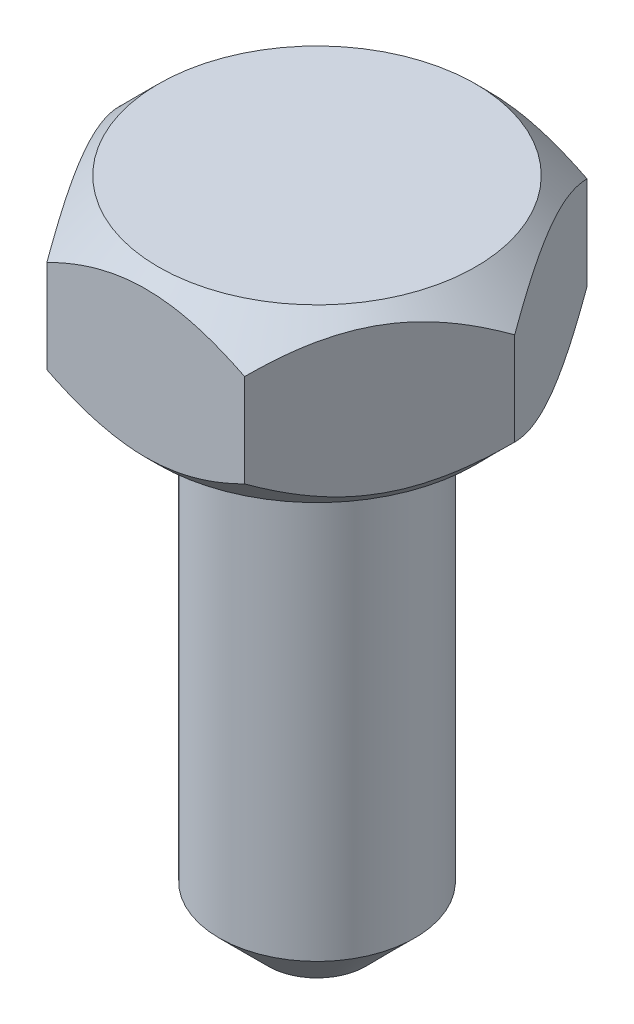
ISO-10303-21;
HEADER;
FILE_DESCRIPTION(('STEP AP214'),'2;1');
FILE_NAME('part.step','',(''),(''),'','','');
FILE_SCHEMA(('AUTOMOTIVE_DESIGN { 1 0 10303 214 1 1 1 1 }'));
ENDSEC;
DATA;
#1=APPLICATION_CONTEXT('core data for automotive mechanical design processes');
#2=APPLICATION_PROTOCOL_DEFINITION('international standard','automotive_design',2000,#1);
#3=PRODUCT_CONTEXT('',#1,'mechanical');
#4=PRODUCT('Part','Part','',(#3));
#5=PRODUCT_RELATED_PRODUCT_CATEGORY('part','',(#4));
#6=PRODUCT_DEFINITION_FORMATION('','',#4);
#7=PRODUCT_DEFINITION_CONTEXT('part definition',#1,'design');
#8=PRODUCT_DEFINITION('design','',#6,#7);
#9=PRODUCT_DEFINITION_SHAPE('','',#8);
#10=(LENGTH_UNIT() NAMED_UNIT(*) SI_UNIT(.MILLI.,.METRE.));
#11=(NAMED_UNIT(*) PLANE_ANGLE_UNIT() SI_UNIT($,.RADIAN.));
#12=(NAMED_UNIT(*) SI_UNIT($,.STERADIAN.) SOLID_ANGLE_UNIT());
#13=UNCERTAINTY_MEASURE_WITH_UNIT(LENGTH_MEASURE(1.E-05),#10,'distance_accuracy_value','');
#14=(GEOMETRIC_REPRESENTATION_CONTEXT(3) GLOBAL_UNCERTAINTY_ASSIGNED_CONTEXT((#13)) GLOBAL_UNIT_ASSIGNED_CONTEXT((#10,
#11,#12)) REPRESENTATION_CONTEXT('',''));
#15=CARTESIAN_POINT('',(0.,0.,0.));
#16=DIRECTION('',(0.,0.,1.));
#17=DIRECTION('',(1.,0.,0.));
#18=AXIS2_PLACEMENT_3D('',#15,#16,#17);
#19=CARTESIAN_POINT('',(-4.04145188432739,-3.5,0.));
#20=DIRECTION('',(0.,1.,0.));
#21=DIRECTION('',(0.,0.,1.));
#22=AXIS2_PLACEMENT_3D('',#19,#20,#21);
#23=PLANE('',#22);
#24=CARTESIAN_POINT('',(0.,-3.5,0.));
#25=DIRECTION('',(0.,1.,0.));
#26=DIRECTION('',(0.,0.,1.));
#27=AXIS2_PLACEMENT_3D('',#24,#25,#26);
#28=CIRCLE('',#27,3.24145188432739);
#29=CARTESIAN_POINT('',(0.,-3.5,3.24145188432739));
#30=VERTEX_POINT('',#29);
#31=EDGE_CURVE('E101',#30,#30,#28,.T.);
#32=ORIENTED_EDGE('',*,*,#31,.F.);
#33=EDGE_LOOP('',(#32));
#34=FACE_BOUND('',#33,.T.);
#35=CARTESIAN_POINT('',(0.,-3.5,0.));
#36=DIRECTION('',(0.,1.,0.));
#37=DIRECTION('',(0.,0.,1.));
#38=AXIS2_PLACEMENT_3D('',#35,#36,#37);
#39=CIRCLE('',#38,2.);
#40=CARTESIAN_POINT('',(0.,-3.5,2.));
#41=VERTEX_POINT('',#40);
#42=EDGE_CURVE('E116',#41,#41,#39,.F.);
#43=ORIENTED_EDGE('',*,*,#42,.F.);
#44=EDGE_LOOP('',(#43));
#45=FACE_BOUND('',#44,.T.);
#46=ADVANCED_FACE('F28',(#34,#45),#23,.F.);
#47=CARTESIAN_POINT('',(0.,-13.5,0.));
#48=DIRECTION('',(0.,1.,0.));
#49=DIRECTION('',(0.,0.,1.));
#50=AXIS2_PLACEMENT_3D('',#47,#48,#49);
#51=CYLINDRICAL_SURFACE('',#50,2.);
#52=CARTESIAN_POINT('',(0.,-12.5,0.));
#53=DIRECTION('',(0.,-1.,0.));
#54=DIRECTION('',(0.,0.,-1.));
#55=AXIS2_PLACEMENT_3D('',#52,#53,#54);
#56=CIRCLE('',#55,2.);
#57=CARTESIAN_POINT('',(0.,-12.5,-2.));
#58=VERTEX_POINT('',#57);
#59=EDGE_CURVE('E41',#58,#58,#56,.F.);
#60=ORIENTED_EDGE('',*,*,#59,.T.);
#61=EDGE_LOOP('',(#60));
#62=FACE_BOUND('',#61,.T.);
#63=ORIENTED_EDGE('',*,*,#42,.T.);
#64=EDGE_LOOP('',(#63));
#65=FACE_BOUND('',#64,.T.);
#66=ADVANCED_FACE('F125',(#62,#65),#51,.T.);
#67=CARTESIAN_POINT('',(0.,-13.5,0.));
#68=DIRECTION('',(0.,-1.,0.));
#69=DIRECTION('',(0.,0.,-1.));
#70=AXIS2_PLACEMENT_3D('',#67,#68,#69);
#71=PLANE('',#70);
#72=CARTESIAN_POINT('',(0.,-13.5,0.));
#73=DIRECTION('',(0.,-1.,0.));
#74=DIRECTION('',(0.,0.,-1.));
#75=AXIS2_PLACEMENT_3D('',#72,#73,#74);
#76=CIRCLE('',#75,0.999999999999997);
#77=CARTESIAN_POINT('',(0.,-13.5,-0.999999999999997));
#78=VERTEX_POINT('',#77);
#79=EDGE_CURVE('E119',#78,#78,#76,.T.);
#80=ORIENTED_EDGE('',*,*,#79,.T.);
#81=EDGE_LOOP('',(#80));
#82=FACE_BOUND('',#81,.T.);
#83=ADVANCED_FACE('F131',(#82),#71,.T.);
#84=CARTESIAN_POINT('',(0.,-13.5,0.));
#85=DIRECTION('',(0.,1.,0.));
#86=DIRECTION('',(0.,0.,1.));
#87=AXIS2_PLACEMENT_3D('',#84,#85,#86);
#88=CONICAL_SURFACE('',#87,0.999999999999997,0.785398163397447);
#89=ORIENTED_EDGE('',*,*,#59,.F.);
#90=EDGE_LOOP('',(#89));
#91=FACE_BOUND('',#90,.T.);
#92=ORIENTED_EDGE('',*,*,#79,.F.);
#93=EDGE_LOOP('',(#92));
#94=FACE_BOUND('',#93,.T.);
#95=ADVANCED_FACE('F128',(#91,#94),#88,.T.);
#96=CARTESIAN_POINT('',(0.,-3.5,0.));
#97=DIRECTION('',(0.,1.,0.));
#98=DIRECTION('',(0.,0.,1.));
#99=AXIS2_PLACEMENT_3D('',#96,#97,#98);
#100=CONICAL_SURFACE('',#99,3.24145188432739,0.785398163397448);
#101=CARTESIAN_POINT('',(-4.04156735438123,-2.69988452499759,0.000200000000024374));
#102=CARTESIAN_POINT('',(-3.97210706066971,-2.76928406626867,-0.120108757816985));
#103=CARTESIAN_POINT('',(-3.90148531215406,-2.83460752114448,-0.242429214365436));
#104=CARTESIAN_POINT('',(-3.75747991147154,-2.95421294831347,-0.491853884911885));
#105=CARTESIAN_POINT('',(-3.68408256574986,-3.00842837712061,-0.618981816842531));
#106=CARTESIAN_POINT('',(-3.53608035685404,-3.10130032476617,-0.875329162282505));
#107=CARTESIAN_POINT('',(-3.4615131811703,-3.14019025979249,-1.00448329914366));
#108=CARTESIAN_POINT('',(-3.310737295381,-3.20010809560693,-1.26563479388693));
#109=CARTESIAN_POINT('',(-3.2345331906662,-3.22118071965238,-1.39762417499826));
#110=CARTESIAN_POINT('',(-3.10319782183118,-3.24019388535166,-1.62510370665133));
#111=CARTESIAN_POINT('',(-3.04823615399914,-3.24300830014006,-1.72030010780514));
#112=CARTESIAN_POINT('',(-2.93840222621348,-3.23826531256006,-1.91053805112477));
#113=CARTESIAN_POINT('',(-2.88353000435282,-3.23070427424299,-2.00557952731161));
#114=CARTESIAN_POINT('',(-2.77430542200353,-3.20564210374561,-2.19476205337608));
#115=CARTESIAN_POINT('',(-2.71995371223669,-3.1881298536199,-2.28890197617048));
#116=CARTESIAN_POINT('',(-2.61218376551828,-3.14412110260569,-2.47556499941575));
#117=CARTESIAN_POINT('',(-2.55876545732786,-3.11762529053566,-2.56808822325595));
#118=CARTESIAN_POINT('',(-2.46393368006796,-3.06311203056568,-2.73234167964214));
#119=CARTESIAN_POINT('',(-2.42231028209656,-3.03652769615024,-2.80443551971227));
#120=CARTESIAN_POINT('',(-2.33981072759412,-2.97907462503668,-2.94732893971228));
#121=CARTESIAN_POINT('',(-2.29893459386685,-2.94820575783654,-3.01812848014491));
#122=CARTESIAN_POINT('',(-2.21805834837752,-2.88287565935588,-3.15821024645784));
#123=CARTESIAN_POINT('',(-2.17805593632086,-2.84842572434904,-3.22749645656527));
#124=CARTESIAN_POINT('',(-2.09879193666162,-2.77638590028467,-3.36478573118621));
#125=CARTESIAN_POINT('',(-2.05952991236256,-2.73879793793946,-3.43278955208019));
#126=CARTESIAN_POINT('',(-2.02061047210986,-2.69988452499759,-3.5002));
#127=B_SPLINE_CURVE_WITH_KNOTS('',3,(#101,#102,#103,#104,#105,#106,#107,#108,#109,#110,#111,
#112,#113,#114,#115,#116,#117,#118,#119,#120,#121,#122,#123,#124,#125,#126),.UNSPECIFIED.,.F.,
.F.,(4,2,2,2,2,2,2,2,2,2,2,2,4),(0.,0.466195029511836,0.935106055247671,1.39657035229711,
1.85687285909026,2.18628459516077,2.51581179896772,2.84570789142401,3.17557869467338,
3.4376213889119,3.69967206642682,3.96091985737579,4.22200840855898),.UNSPECIFIED.);
#128=CARTESIAN_POINT('',(-4.04145188432739,-2.7,0.));
#129=VERTEX_POINT('',#128);
#130=CARTESIAN_POINT('',(-2.02072594216371,-2.7,-3.5));
#131=VERTEX_POINT('',#130);
#132=EDGE_CURVE('E176',#129,#131,#127,.T.);
#133=ORIENTED_EDGE('',*,*,#132,.T.);
#134=CARTESIAN_POINT('',(-4.11343909523356,-1.34049074854832,-3.5));
#135=CARTESIAN_POINT('',(-4.01364790461446,-1.41647576800568,-3.5));
#136=CARTESIAN_POINT('',(-3.91330741187747,-1.4917509457735,-3.5));
#137=CARTESIAN_POINT('',(-3.71130759190236,-1.64056086288985,-3.5));
#138=CARTESIAN_POINT('',(-3.60964794828074,-1.71409517230361,-3.5));
#139=CARTESIAN_POINT('',(-3.40404593483019,-1.85962589901091,-3.5));
#140=CARTESIAN_POINT('',(-3.30009198936034,-1.93160601709034,-3.5));
#141=CARTESIAN_POINT('',(-3.09043455319368,-2.07296300910746,-3.5));
#142=CARTESIAN_POINT('',(-2.98473118535169,-2.14234006473914,-3.5));
#143=CARTESIAN_POINT('',(-2.76489352426084,-2.28196781927053,-3.5));
#144=CARTESIAN_POINT('',(-2.65063360057755,-2.35202171786016,-3.5));
#145=CARTESIAN_POINT('',(-2.41943843809483,-2.48764015461377,-3.5));
#146=CARTESIAN_POINT('',(-2.30250276768208,-2.55320396159193,-3.5));
#147=CARTESIAN_POINT('',(-2.06594770908092,-2.6784356928961,-3.5));
#148=CARTESIAN_POINT('',(-1.94633756764447,-2.73812094705998,-3.5));
#149=CARTESIAN_POINT('',(-1.70380065325271,-2.85025883184051,-3.5));
#150=CARTESIAN_POINT('',(-1.58087544221088,-2.90271479977525,-3.5));
#151=CARTESIAN_POINT('',(-1.34256664054354,-2.99425414604565,-3.5));
#152=CARTESIAN_POINT('',(-1.22748347184254,-3.03411159832747,-3.5));
#153=CARTESIAN_POINT('',(-0.994473602956439,-3.10460445258339,-3.5));
#154=CARTESIAN_POINT('',(-0.876546714407832,-3.13523924184055,-3.5));
#155=CARTESIAN_POINT('',(-0.640555797612561,-3.18515136149643,-3.5));
#156=CARTESIAN_POINT('',(-0.522534731770002,-3.20462846737207,-3.5));
#157=CARTESIAN_POINT('',(-0.285138833258746,-3.23183388871137,-3.5));
#158=CARTESIAN_POINT('',(-0.165764258218942,-3.23956440343576,-3.5));
#159=CARTESIAN_POINT('',(0.0684345425591306,-3.24266430583436,-3.5));
#160=CARTESIAN_POINT('',(0.183252604656246,-3.23850904804464,-3.5));
#161=CARTESIAN_POINT('',(0.41194538139855,-3.21913596089254,-3.5));
#162=CARTESIAN_POINT('',(0.525820005903612,-3.20391708651605,-3.5));
#163=CARTESIAN_POINT('',(0.753728692005361,-3.16300182207144,-3.5));
#164=CARTESIAN_POINT('',(0.867729673651151,-3.13712416826838,-3.5));
#165=CARTESIAN_POINT('',(1.09323660944141,-3.07629621041035,-3.5));
#166=CARTESIAN_POINT('',(1.20474274230377,-3.04134655850057,-3.5));
#167=CARTESIAN_POINT('',(1.43351745819777,-2.96089193875029,-3.5));
#168=CARTESIAN_POINT('',(1.55057121674902,-2.91478260530312,-3.5));
#169=CARTESIAN_POINT('',(1.78163768388521,-2.81546896217881,-3.5));
#170=CARTESIAN_POINT('',(1.8956493792125,-2.76226232305919,-3.5));
#171=CARTESIAN_POINT('',(2.12120309504484,-2.65000927106598,-3.5));
#172=CARTESIAN_POINT('',(2.23273581617762,-2.59094432351664,-3.5));
#173=CARTESIAN_POINT('',(2.45323999840432,-2.46828035973536,-3.5));
#174=CARTESIAN_POINT('',(2.56221185705048,-2.40468205353482,-3.5));
#175=CARTESIAN_POINT('',(2.77258648527557,-2.27708230144591,-3.5));
#176=CARTESIAN_POINT('',(2.87409670716152,-2.21325707762329,-3.5));
#177=CARTESIAN_POINT('',(3.07537374659972,-2.08290631812229,-3.5));
#178=CARTESIAN_POINT('',(3.17514043189724,-2.01638057885912,-3.5));
#179=CARTESIAN_POINT('',(3.37235277259435,-1.88165662424084,-3.5));
#180=CARTESIAN_POINT('',(3.46981066719971,-1.81347626064957,-3.5));
#181=CARTESIAN_POINT('',(3.66339199507936,-1.67530022312019,-3.5));
#182=CARTESIAN_POINT('',(3.75951578844138,-1.60530505424452,-3.5));
#183=CARTESIAN_POINT('',(3.85508044256854,-1.53456747820942,-3.5));
#184=B_SPLINE_CURVE_WITH_KNOTS('',3,(#134,#135,#136,#137,#138,#139,#140,#141,#142,#143,#144,
#145,#146,#147,#148,#149,#150,#151,#152,#153,#154,#155,#156,#157,#158,#159,#160,#161,#162,#163,
#164,#165,#166,#167,#168,#169,#170,#171,#172,#173,#174,#175,#176,#177,#178,#179,#180,#181,#182,
#183),.UNSPECIFIED.,.F.,.F.,(4,2,2,2,2,2,2,2,2,2,2,2,2,2,2,2,2,2,2,2,2,2,2,2,4),(0.,
0.376289066832934,0.752670114666427,1.13196303882771,1.51122943887124,1.91322439656266,
2.31528466194431,2.71612176675466,3.11677320534959,3.48182442073459,3.84689988331699,
4.20521619183289,4.56346540614943,4.90758964289977,5.25174638813573,5.60201478075691,
5.95225800112648,6.32939036689254,6.70664681914763,7.08513741857289,7.46356886710629,
7.82324340751906,8.18294511339456,8.53974109313966,8.89643881996947),.UNSPECIFIED.);
#185=CARTESIAN_POINT('',(2.02072594216368,-2.7,-3.50000000000001));
#186=VERTEX_POINT('',#185);
#187=EDGE_CURVE('E170',#131,#186,#184,.T.);
#188=ORIENTED_EDGE('',*,*,#187,.T.);
#189=CARTESIAN_POINT('',(2.02061047210985,-2.69988452499759,-3.5002));
#190=CARTESIAN_POINT('',(2.09007076582137,-2.76928406626868,-3.37989124218299));
#191=CARTESIAN_POINT('',(2.16069251433702,-2.83460752114448,-3.25757078563454));
#192=CARTESIAN_POINT('',(2.30469791501954,-2.95421294831348,-3.00814611508809));
#193=CARTESIAN_POINT('',(2.37809526074122,-3.00842837712062,-2.88101818315745));
#194=CARTESIAN_POINT('',(2.52609746963704,-3.10130032476617,-2.62467083771748));
#195=CARTESIAN_POINT('',(2.60066464532078,-3.14019025979249,-2.49551670085632));
#196=CARTESIAN_POINT('',(2.75144053111008,-3.20010809560693,-2.23436520611305));
#197=CARTESIAN_POINT('',(2.82764463582487,-3.22118071965239,-2.10237582500172));
#198=CARTESIAN_POINT('',(2.9589800046599,-3.24019388535166,-1.87489629334866));
#199=CARTESIAN_POINT('',(3.01394167249194,-3.24300830014006,-1.77969989219485));
#200=CARTESIAN_POINT('',(3.1237756002776,-3.23826531256006,-1.58946194887522));
#201=CARTESIAN_POINT('',(3.17864782213825,-3.230704274243,-1.49442047268838));
#202=CARTESIAN_POINT('',(3.28787240448755,-3.20564210374561,-1.30523794662391));
#203=CARTESIAN_POINT('',(3.34222411425439,-3.1881298536199,-1.21109802382951));
#204=CARTESIAN_POINT('',(3.4499940609728,-3.14412110260569,-1.02443500058424));
#205=CARTESIAN_POINT('',(3.50341236916322,-3.11762529053567,-0.931911776744044));
#206=CARTESIAN_POINT('',(3.59824414642312,-3.06311203056568,-0.767658320357851));
#207=CARTESIAN_POINT('',(3.63986754439452,-3.03652769615024,-0.695564480287725));
#208=CARTESIAN_POINT('',(3.72236709889696,-2.97907462503668,-0.552671060287705));
#209=CARTESIAN_POINT('',(3.76324323262423,-2.94820575783654,-0.481871519855081));
#210=CARTESIAN_POINT('',(3.84411947811356,-2.88287565935588,-0.34178975354215));
#211=CARTESIAN_POINT('',(3.88412189017022,-2.84842572434904,-0.272503543434718));
#212=CARTESIAN_POINT('',(3.96338588982947,-2.77638590028467,-0.135214268813778));
#213=CARTESIAN_POINT('',(4.00264791412853,-2.73879793793945,-0.0672104479197992));
#214=CARTESIAN_POINT('',(4.04156735438122,-2.69988452499759,0.0002000000000135));
#215=B_SPLINE_CURVE_WITH_KNOTS('',3,(#189,#190,#191,#192,#193,#194,#195,#196,#197,#198,#199,
#200,#201,#202,#203,#204,#205,#206,#207,#208,#209,#210,#211,#212,#213,#214),.UNSPECIFIED.,.F.,
.F.,(4,2,2,2,2,2,2,2,2,2,2,2,4),(0.,0.466195029511833,0.935106055247665,1.3965703522971,
1.85687285909024,2.18628459516076,2.51581179896771,2.84570789142399,3.17557869467336,
3.43762138891188,3.69967206642681,3.96091985737578,4.22200840855897),.UNSPECIFIED.);
#216=CARTESIAN_POINT('',(4.04145188432739,-2.7,0.));
#217=VERTEX_POINT('',#216);
#218=EDGE_CURVE('E89',#186,#217,#215,.T.);
#219=ORIENTED_EDGE('',*,*,#218,.T.);
#220=CARTESIAN_POINT('',(4.04156735438122,-2.69988452499759,-0.000199999999987047));
#221=CARTESIAN_POINT('',(3.9721070606697,-2.76928406626868,0.120108757817022));
#222=CARTESIAN_POINT('',(3.90148531215406,-2.83460752114448,0.242429214365472));
#223=CARTESIAN_POINT('',(3.75747991147153,-2.95421294831348,0.491853884911919));
#224=CARTESIAN_POINT('',(3.68408256574985,-3.00842837712061,0.618981816842565));
#225=CARTESIAN_POINT('',(3.53608035685403,-3.10130032476617,0.875329162282538));
#226=CARTESIAN_POINT('',(3.46151318117029,-3.14019025979249,1.00448329914369));
#227=CARTESIAN_POINT('',(3.31073729538099,-3.20010809560693,1.26563479388696));
#228=CARTESIAN_POINT('',(3.23453319066619,-3.22118071965238,1.39762417499829));
#229=CARTESIAN_POINT('',(3.10319782183116,-3.24019388535166,1.62510370665136));
#230=CARTESIAN_POINT('',(3.04823615399913,-3.24300830014006,1.72030010780516));
#231=CARTESIAN_POINT('',(2.93840222621346,-3.23826531256006,1.91053805112479));
#232=CARTESIAN_POINT('',(2.88353000435281,-3.230704274243,2.00557952731163));
#233=CARTESIAN_POINT('',(2.77430542200351,-3.20564210374561,2.19476205337611));
#234=CARTESIAN_POINT('',(2.71995371223667,-3.1881298536199,2.2889019761705));
#235=CARTESIAN_POINT('',(2.61218376551826,-3.14412110260569,2.47556499941577));
#236=CARTESIAN_POINT('',(2.55876545732783,-3.11762529053566,2.56808822325597));
#237=CARTESIAN_POINT('',(2.46393368006794,-3.06311203056568,2.73234167964216));
#238=CARTESIAN_POINT('',(2.42231028209654,-3.03652769615024,2.80443551971228));
#239=CARTESIAN_POINT('',(2.3398107275941,-2.97907462503668,2.9473289397123));
#240=CARTESIAN_POINT('',(2.29893459386683,-2.94820575783654,3.01812848014492));
#241=CARTESIAN_POINT('',(2.2180583483775,-2.88287565935588,3.15821024645785));
#242=CARTESIAN_POINT('',(2.17805593632084,-2.84842572434904,3.22749645656528));
#243=CARTESIAN_POINT('',(2.0987919366616,-2.77638590028468,3.36478573118621));
#244=CARTESIAN_POINT('',(2.05952991236254,-2.73879793793947,3.43278955208019));
#245=CARTESIAN_POINT('',(2.02061047210984,-2.6998845249976,3.5002));
#246=B_SPLINE_CURVE_WITH_KNOTS('',3,(#220,#221,#222,#223,#224,#225,#226,#227,#228,#229,#230,
#231,#232,#233,#234,#235,#236,#237,#238,#239,#240,#241,#242,#243,#244,#245),.UNSPECIFIED.,.F.,
.F.,(4,2,2,2,2,2,2,2,2,2,2,2,4),(0.,0.466195029511836,0.93510605524767,1.39657035229711,
1.85687285909025,2.18628459516077,2.51581179896772,2.845707891424,3.17557869467337,
3.43762138891189,3.69967206642681,3.96091985737577,4.22200840855895),.UNSPECIFIED.);
#247=CARTESIAN_POINT('',(2.02072594216371,-2.7,3.5));
#248=VERTEX_POINT('',#247);
#249=EDGE_CURVE('E85',#217,#248,#246,.T.);
#250=ORIENTED_EDGE('',*,*,#249,.T.);
#251=CARTESIAN_POINT('',(-4.11343909532792,-1.34049074847645,3.5));
#252=CARTESIAN_POINT('',(-4.01364790470614,-1.41647576793658,3.5));
#253=CARTESIAN_POINT('',(-3.91330741196645,-1.49175094570717,3.5));
#254=CARTESIAN_POINT('',(-3.71130759198594,-1.64056086282906,3.5));
#255=CARTESIAN_POINT('',(-3.6096479483616,-1.71409517224557,3.5));
#256=CARTESIAN_POINT('',(-3.40404593490552,-1.8596258989584,3.5));
#257=CARTESIAN_POINT('',(-3.30009198943286,-1.9316060170406,3.5));
#258=CARTESIAN_POINT('',(-3.09043455326054,-2.07296300906322,3.5));
#259=CARTESIAN_POINT('',(-2.98473118541569,-2.14234006469764,3.5));
#260=CARTESIAN_POINT('',(-2.76489352431867,-2.28196781923471,3.5));
#261=CARTESIAN_POINT('',(-2.65063360063206,-2.35202171782728,3.5));
#262=CARTESIAN_POINT('',(-2.41943843814258,-2.48764015458666,3.5));
#263=CARTESIAN_POINT('',(-2.3025027677264,-2.55320396156762,3.5));
#264=CARTESIAN_POINT('',(-2.06594770911824,-2.67843569287718,3.5));
#265=CARTESIAN_POINT('',(-1.94633756767823,-2.73812094704364,3.5));
#266=CARTESIAN_POINT('',(-1.70380065327916,-2.85025883182901,3.5));
#267=CARTESIAN_POINT('',(-1.58087544223358,-2.902714799766,3.5));
#268=CARTESIAN_POINT('',(-1.34256664056464,-2.99425414603802,3.5));
#269=CARTESIAN_POINT('',(-1.22748347186597,-3.03411159831963,3.5));
#270=CARTESIAN_POINT('',(-0.994473602984598,-3.10460445257561,3.5));
#271=CARTESIAN_POINT('',(-0.876546714438396,-3.13523924183304,3.5));
#272=CARTESIAN_POINT('',(-0.640555797647857,-3.18515136148999,3.5));
#273=CARTESIAN_POINT('',(-0.522534731807625,-3.20462846736643,3.5));
#274=CARTESIAN_POINT('',(-0.285138833300951,-3.23183388870786,3.5));
#275=CARTESIAN_POINT('',(-0.165764258263403,-3.23956440343358,3.5));
#276=CARTESIAN_POINT('',(0.0684345425106541,-3.24266430583524,3.5));
#277=CARTESIAN_POINT('',(0.183252604606004,-3.23850904804722,3.5));
#278=CARTESIAN_POINT('',(0.411945381344963,-3.21913596089876,3.5));
#279=CARTESIAN_POINT('',(0.525820005848445,-3.20391708652421,3.5));
#280=CARTESIAN_POINT('',(0.753728691947076,-3.16300182208367,3.5));
#281=CARTESIAN_POINT('',(0.867729673591332,-3.13712416828275,3.5));
#282=CARTESIAN_POINT('',(1.09323660937868,-3.07629621042903,3.5));
#283=CARTESIAN_POINT('',(1.20474274223966,-3.04134655852143,3.5));
#284=CARTESIAN_POINT('',(1.4335174581261,-2.96089193877731,3.5));
#285=CARTESIAN_POINT('',(1.5505712166713,-2.9147826053345,3.5));
#286=CARTESIAN_POINT('',(1.78163768379569,-2.81546896221932,3.5));
#287=CARTESIAN_POINT('',(1.89564937911723,-2.76226232310448,3.5));
#288=CARTESIAN_POINT('',(2.12120309493829,-2.65000927112113,3.5));
#289=CARTESIAN_POINT('',(2.23273581606554,-2.59094432357686,3.5));
#290=CARTESIAN_POINT('',(2.45323999828135,-2.46828035980589,3.5));
#291=CARTESIAN_POINT('',(2.56221185692215,-2.40468205361059,3.5));
#292=CARTESIAN_POINT('',(2.77258648513752,-2.27708230153161,3.5));
#293=CARTESIAN_POINT('',(2.87409670701908,-2.21325707771367,3.5));
#294=CARTESIAN_POINT('',(3.07537374644856,-2.08290631822205,3.5));
#295=CARTESIAN_POINT('',(3.17514043174175,-2.01638057896358,3.5));
#296=CARTESIAN_POINT('',(3.37235277243031,-1.88165662435465,3.5));
#297=CARTESIAN_POINT('',(3.46981066703145,-1.81347626076803,3.5));
#298=CARTESIAN_POINT('',(3.66339199490269,-1.67530022324793,3.5));
#299=CARTESIAN_POINT('',(3.75951578826051,-1.60530505437691,3.5));
#300=CARTESIAN_POINT('',(3.85508044238348,-1.53456747834644,3.5));
#301=B_SPLINE_CURVE_WITH_KNOTS('',3,(#251,#252,#253,#254,#255,#256,#257,#258,#259,#260,#261,
#262,#263,#264,#265,#266,#267,#268,#269,#270,#271,#272,#273,#274,#275,#276,#277,#278,#279,#280,
#281,#282,#283,#284,#285,#286,#287,#288,#289,#290,#291,#292,#293,#294,#295,#296,#297,#298,#299,
#300),.UNSPECIFIED.,.F.,.F.,(4,2,2,2,2,2,2,2,2,2,2,2,2,2,2,2,2,2,2,2,2,2,2,2,4),(0.,
0.376289066844382,0.752670114689327,1.13196303886228,1.51122943891747,1.91322439662199,
2.31528466201676,2.7161217668401,3.11677320544801,3.48182442082625,3.84689988340191,
4.20521619191135,4.56346540622143,4.90758964296631,5.25174638819682,5.60201478081209,
5.95225800117576,6.32939036692017,6.70664681915359,7.08513741855706,7.46356886706867,
7.82324340746283,8.1829451133197,8.53974109304643,8.89643881985787),.UNSPECIFIED.);
#302=CARTESIAN_POINT('',(-2.02072594216367,-2.70000000000002,3.5));
#303=VERTEX_POINT('',#302);
#304=EDGE_CURVE('E47',#248,#303,#301,.F.);
#305=ORIENTED_EDGE('',*,*,#304,.T.);
#306=CARTESIAN_POINT('',(-2.02061047210983,-2.69988452499761,3.5002));
#307=CARTESIAN_POINT('',(-2.09007076582135,-2.76928406626869,3.37989124218299));
#308=CARTESIAN_POINT('',(-2.160692514337,-2.83460752114449,3.25757078563455));
#309=CARTESIAN_POINT('',(-2.30469791501952,-2.95421294831349,3.0081461150881));
#310=CARTESIAN_POINT('',(-2.3780952607412,-3.00842837712062,2.88101818315746));
#311=CARTESIAN_POINT('',(-2.52609746963702,-3.10130032476618,2.62467083771749));
#312=CARTESIAN_POINT('',(-2.60066464532076,-3.14019025979249,2.49551670085634));
#313=CARTESIAN_POINT('',(-2.75144053111006,-3.20010809560693,2.23436520611307));
#314=CARTESIAN_POINT('',(-2.82764463582486,-3.22118071965239,2.10237582500175));
#315=CARTESIAN_POINT('',(-2.95898000465988,-3.24019388535166,1.87489629334868));
#316=CARTESIAN_POINT('',(-3.01394167249192,-3.24300830014006,1.77969989219488));
#317=CARTESIAN_POINT('',(-3.12377560027759,-3.23826531256006,1.58946194887525));
#318=CARTESIAN_POINT('',(-3.17864782213824,-3.23070427424299,1.49442047268841));
#319=CARTESIAN_POINT('',(-3.28787240448754,-3.20564210374561,1.30523794662394));
#320=CARTESIAN_POINT('',(-3.34222411425438,-3.1881298536199,1.21109802382954));
#321=CARTESIAN_POINT('',(-3.44999406097279,-3.14412110260569,1.02443500058427));
#322=CARTESIAN_POINT('',(-3.50341236916322,-3.11762529053566,0.931911776744076));
#323=CARTESIAN_POINT('',(-3.59824414642311,-3.06311203056568,0.767658320357883));
#324=CARTESIAN_POINT('',(-3.63986754439451,-3.03652769615024,0.695564480287757));
#325=CARTESIAN_POINT('',(-3.72236709889695,-2.97907462503668,0.552671060287739));
#326=CARTESIAN_POINT('',(-3.76324323262423,-2.94820575783654,0.481871519855115));
#327=CARTESIAN_POINT('',(-3.84411947811356,-2.88287565935587,0.341789753542185));
#328=CARTESIAN_POINT('',(-3.88412189017022,-2.84842572434903,0.272503543434753));
#329=CARTESIAN_POINT('',(-3.96338588982947,-2.77638590028466,0.135214268813814));
#330=CARTESIAN_POINT('',(-4.00264791412853,-2.73879793793945,0.0672104479198364));
#331=CARTESIAN_POINT('',(-4.04156735438123,-2.69988452499759,-0.000199999999975865));
#332=B_SPLINE_CURVE_WITH_KNOTS('',3,(#306,#307,#308,#309,#310,#311,#312,#313,#314,#315,#316,
#317,#318,#319,#320,#321,#322,#323,#324,#325,#326,#327,#328,#329,#330,#331),.UNSPECIFIED.,.F.,
.F.,(4,2,2,2,2,2,2,2,2,2,2,2,4),(0.,0.466195029511828,0.935106055247654,1.39657035229708,
1.85687285909022,2.18628459516074,2.51581179896768,2.84570789142397,3.17557869467334,
3.43762138891186,3.69967206642679,3.96091985737576,4.22200840855895),.UNSPECIFIED.);
#333=EDGE_CURVE('E11',#303,#129,#332,.T.);
#334=ORIENTED_EDGE('',*,*,#333,.T.);
#335=EDGE_LOOP('',(#133,#188,#219,#250,#305,#334));
#336=FACE_BOUND('',#335,.T.);
#337=ORIENTED_EDGE('',*,*,#31,.T.);
#338=EDGE_LOOP('',(#337));
#339=FACE_BOUND('',#338,.T.);
#340=ADVANCED_FACE('F86',(#336,#339),#100,.T.);
#341=CARTESIAN_POINT('',(-4.04145188432739,0.,0.));
#342=DIRECTION('',(0.,1.,0.));
#343=DIRECTION('',(0.,0.,1.));
#344=AXIS2_PLACEMENT_3D('',#341,#342,#343);
#345=PLANE('',#344);
#346=CARTESIAN_POINT('',(0.,0.,0.));
#347=DIRECTION('',(0.,1.,0.));
#348=DIRECTION('',(0.,0.,1.));
#349=AXIS2_PLACEMENT_3D('',#346,#347,#348);
#350=CIRCLE('',#349,3.24145188432739);
#351=CARTESIAN_POINT('',(0.,0.,3.24145188432739));
#352=VERTEX_POINT('',#351);
#353=EDGE_CURVE('E233',#352,#352,#350,.T.);
#354=ORIENTED_EDGE('',*,*,#353,.T.);
#355=EDGE_LOOP('',(#354));
#356=FACE_BOUND('',#355,.T.);
#357=ADVANCED_FACE('F151',(#356),#345,.T.);
#358=CARTESIAN_POINT('',(0.,-0.8,0.));
#359=DIRECTION('',(0.,-1.,0.));
#360=DIRECTION('',(0.,0.,-1.));
#361=AXIS2_PLACEMENT_3D('',#358,#359,#360);
#362=CONICAL_SURFACE('',#361,4.04145188432739,0.785398163397448);
#363=CARTESIAN_POINT('',(-2.02061047210986,-0.800115475002408,-3.5002));
#364=CARTESIAN_POINT('',(-2.09007076582138,-0.730715933731321,-3.37989124218299));
#365=CARTESIAN_POINT('',(-2.16069251433702,-0.665392478855521,-3.25757078563454));
#366=CARTESIAN_POINT('',(-2.30469791501955,-0.545787051686524,-3.00814611508809));
#367=CARTESIAN_POINT('',(-2.37809526074123,-0.491571622879386,-2.88101818315745));
#368=CARTESIAN_POINT('',(-2.52609746963704,-0.398699675233827,-2.62467083771747));
#369=CARTESIAN_POINT('',(-2.60066464532078,-0.359809740207512,-2.49551670085632));
#370=CARTESIAN_POINT('',(-2.75144053111008,-0.299891904393072,-2.23436520611305));
#371=CARTESIAN_POINT('',(-2.82764463582488,-0.278819280347616,-2.10237582500172));
#372=CARTESIAN_POINT('',(-2.95898000465991,-0.259806114648342,-1.87489629334865));
#373=CARTESIAN_POINT('',(-3.01394167249194,-0.256991699859938,-1.77969989219485));
#374=CARTESIAN_POINT('',(-3.12377560027761,-0.261734687439937,-1.58946194887522));
#375=CARTESIAN_POINT('',(-3.17864782213826,-0.269295725757006,-1.49442047268838));
#376=CARTESIAN_POINT('',(-3.28787240448756,-0.294357896254393,-1.3052379466239));
#377=CARTESIAN_POINT('',(-3.34222411425439,-0.311870146380099,-1.2110980238295));
#378=CARTESIAN_POINT('',(-3.4499940609728,-0.355878897394313,-1.02443500058423));
#379=CARTESIAN_POINT('',(-3.50341236916323,-0.382374709464336,-0.931911776744037));
#380=CARTESIAN_POINT('',(-3.59824414642312,-0.436887969434318,-0.767658320357844));
#381=CARTESIAN_POINT('',(-3.63986754439452,-0.463472303849764,-0.695564480287717));
#382=CARTESIAN_POINT('',(-3.72236709889696,-0.520925374963324,-0.552671060287697));
#383=CARTESIAN_POINT('',(-3.76324323262424,-0.551794242163462,-0.481871519855072));
#384=CARTESIAN_POINT('',(-3.84411947811357,-0.617124340644127,-0.34178975354214));
#385=CARTESIAN_POINT('',(-3.88412189017022,-0.651574275650966,-0.272503543434707));
#386=CARTESIAN_POINT('',(-3.96338588982947,-0.723614099715335,-0.135214268813767));
#387=CARTESIAN_POINT('',(-4.00264791412853,-0.761202062060548,-0.0672104479197882));
#388=CARTESIAN_POINT('',(-4.04156735438123,-0.800115475002413,0.000200000000024801));
#389=B_SPLINE_CURVE_WITH_KNOTS('',3,(#363,#364,#365,#366,#367,#368,#369,#370,#371,#372,#373,
#374,#375,#376,#377,#378,#379,#380,#381,#382,#383,#384,#385,#386,#387,#388),.UNSPECIFIED.,.F.,
.F.,(4,2,2,2,2,2,2,2,2,2,2,2,4),(0.,0.466195029511835,0.935106055247666,1.3965703522971,
1.85687285909025,2.18628459516076,2.51581179896771,2.84570789142399,3.17557869467337,
3.43762138891189,3.69967206642682,3.96091985737579,4.22200840855898),.UNSPECIFIED.);
#390=CARTESIAN_POINT('',(-2.02072594216371,-0.8,-3.5));
#391=VERTEX_POINT('',#390);
#392=CARTESIAN_POINT('',(-4.04145188432739,-0.8,0.));
#393=VERTEX_POINT('',#392);
#394=EDGE_CURVE('E115',#391,#393,#389,.T.);
#395=ORIENTED_EDGE('',*,*,#394,.T.);
#396=CARTESIAN_POINT('',(-4.04156735438123,-0.800115475002413,-0.000199999999975714));
#397=CARTESIAN_POINT('',(-3.97210706066971,-0.730715933731326,0.120108757817033));
#398=CARTESIAN_POINT('',(-3.90148531215406,-0.665392478855525,0.242429214365483));
#399=CARTESIAN_POINT('',(-3.75747991147153,-0.545787051686527,0.491853884911931));
#400=CARTESIAN_POINT('',(-3.68408256574985,-0.491571622879387,0.618981816842576));
#401=CARTESIAN_POINT('',(-3.53608035685403,-0.398699675233828,0.875329162282549));
#402=CARTESIAN_POINT('',(-3.46151318117029,-0.359809740207512,1.00448329914371));
#403=CARTESIAN_POINT('',(-3.31073729538099,-0.299891904393072,1.26563479388697));
#404=CARTESIAN_POINT('',(-3.23453319066619,-0.278819280347615,1.3976241749983));
#405=CARTESIAN_POINT('',(-3.10319782183116,-0.259806114648342,1.62510370665137));
#406=CARTESIAN_POINT('',(-3.04823615399912,-0.256991699859937,1.72030010780518));
#407=CARTESIAN_POINT('',(-2.93840222621345,-0.261734687439936,1.9105380511248));
#408=CARTESIAN_POINT('',(-2.8835300043528,-0.269295725757005,2.00557952731164));
#409=CARTESIAN_POINT('',(-2.7743054220035,-0.294357896254393,2.19476205337612));
#410=CARTESIAN_POINT('',(-2.71995371223666,-0.311870146380098,2.28890197617051));
#411=CARTESIAN_POINT('',(-2.61218376551825,-0.355878897394311,2.47556499941578));
#412=CARTESIAN_POINT('',(-2.55876545732782,-0.382374709464335,2.56808822325598));
#413=CARTESIAN_POINT('',(-2.46393368006793,-0.436887969434316,2.73234167964217));
#414=CARTESIAN_POINT('',(-2.42231028209653,-0.463472303849761,2.80443551971229));
#415=CARTESIAN_POINT('',(-2.33981072759409,-0.520925374963319,2.9473289397123));
#416=CARTESIAN_POINT('',(-2.29893459386682,-0.551794242163455,3.01812848014493));
#417=CARTESIAN_POINT('',(-2.21805834837749,-0.617124340644116,3.15821024645785));
#418=CARTESIAN_POINT('',(-2.17805593632083,-0.651574275650953,3.22749645656528));
#419=CARTESIAN_POINT('',(-2.09879193666159,-0.723614099715318,3.36478573118622));
#420=CARTESIAN_POINT('',(-2.05952991236253,-0.76120206206053,3.43278955208019));
#421=CARTESIAN_POINT('',(-2.02061047210983,-0.800115475002393,3.5002));
#422=B_SPLINE_CURVE_WITH_KNOTS('',3,(#396,#397,#398,#399,#400,#401,#402,#403,#404,#405,#406,
#407,#408,#409,#410,#411,#412,#413,#414,#415,#416,#417,#418,#419,#420,#421),.UNSPECIFIED.,.F.,
.F.,(4,2,2,2,2,2,2,2,2,2,2,2,4),(0.,0.466195029511837,0.935106055247672,1.39657035229711,
1.85687285909026,2.18628459516077,2.51581179896772,2.84570789142401,3.17557869467338,
3.43762138891189,3.69967206642681,3.96091985737577,4.22200840855895),.UNSPECIFIED.);
#423=CARTESIAN_POINT('',(-2.02072594216365,-0.8,3.50000000000003));
#424=VERTEX_POINT('',#423);
#425=EDGE_CURVE('E236',#393,#424,#422,.T.);
#426=ORIENTED_EDGE('',*,*,#425,.T.);
#427=CARTESIAN_POINT('',(-4.11343909532793,-2.15950925152355,3.5));
#428=CARTESIAN_POINT('',(-4.01364790470614,-2.08352423206342,3.5));
#429=CARTESIAN_POINT('',(-3.91330741196646,-2.00824905429283,3.5));
#430=CARTESIAN_POINT('',(-3.71130759198594,-1.85943913717094,3.5));
#431=CARTESIAN_POINT('',(-3.60964794836161,-1.78590482775444,3.5));
#432=CARTESIAN_POINT('',(-3.40404593490553,-1.6403741010416,3.5));
#433=CARTESIAN_POINT('',(-3.30009198943287,-1.5683939829594,3.5));
#434=CARTESIAN_POINT('',(-3.09043455326054,-1.42703699093678,3.5));
#435=CARTESIAN_POINT('',(-2.98473118541569,-1.35765993530237,3.5));
#436=CARTESIAN_POINT('',(-2.76489352431867,-1.21803218076529,3.5));
#437=CARTESIAN_POINT('',(-2.65063360063207,-1.14797828217272,3.5));
#438=CARTESIAN_POINT('',(-2.41943843814259,-1.01235984541334,3.5));
#439=CARTESIAN_POINT('',(-2.3025027677264,-0.946796038432376,3.5));
#440=CARTESIAN_POINT('',(-2.06594770911824,-0.82156430712282,3.5));
#441=CARTESIAN_POINT('',(-1.94633756767823,-0.761879052956364,3.5));
#442=CARTESIAN_POINT('',(-1.70380065327916,-0.649741168170993,3.5));
#443=CARTESIAN_POINT('',(-1.58087544223358,-0.597285200233999,3.5));
#444=CARTESIAN_POINT('',(-1.34256664056464,-0.505745853961981,3.5));
#445=CARTESIAN_POINT('',(-1.22748347186597,-0.465888401680367,3.5));
#446=CARTESIAN_POINT('',(-0.994473602984597,-0.395395547424386,3.5));
#447=CARTESIAN_POINT('',(-0.876546714438395,-0.364760758166964,3.5));
#448=CARTESIAN_POINT('',(-0.640555797647857,-0.314848638510006,3.5));
#449=CARTESIAN_POINT('',(-0.522534731807625,-0.295371532633568,3.5));
#450=CARTESIAN_POINT('',(-0.285138833300951,-0.268166111292142,3.5));
#451=CARTESIAN_POINT('',(-0.165764258263404,-0.260435596566415,3.5));
#452=CARTESIAN_POINT('',(0.0684345425106533,-0.257335694164756,3.5));
#453=CARTESIAN_POINT('',(0.183252604606004,-0.261490951952784,3.5));
#454=CARTESIAN_POINT('',(0.411945381344962,-0.280864039101239,3.5));
#455=CARTESIAN_POINT('',(0.525820005848445,-0.29608291347579,3.5));
#456=CARTESIAN_POINT('',(0.753728691947075,-0.336998177916329,3.5));
#457=CARTESIAN_POINT('',(0.867729673591331,-0.362875831717248,3.5));
#458=CARTESIAN_POINT('',(1.09323660937868,-0.423703789570965,3.5));
#459=CARTESIAN_POINT('',(1.20474274223966,-0.458653441478571,3.5));
#460=CARTESIAN_POINT('',(1.43351745812609,-0.539108061222685,3.5));
#461=CARTESIAN_POINT('',(1.5505712166713,-0.585217394665504,3.5));
#462=CARTESIAN_POINT('',(1.78163768379568,-0.684531037780684,3.5));
#463=CARTESIAN_POINT('',(1.89564937911723,-0.737737676895517,3.5));
#464=CARTESIAN_POINT('',(2.12120309493829,-0.849990728878866,3.5));
#465=CARTESIAN_POINT('',(2.23273581606554,-0.909055676423135,3.5));
#466=CARTESIAN_POINT('',(2.45323999828134,-1.03171964019411,3.5));
#467=CARTESIAN_POINT('',(2.56221185692215,-1.09531794638941,3.5));
#468=CARTESIAN_POINT('',(2.77258648513752,-1.22291769846839,3.5));
#469=CARTESIAN_POINT('',(2.87409670701908,-1.28674292228633,3.5));
#470=CARTESIAN_POINT('',(3.07537374644856,-1.41709368177794,3.5));
#471=CARTESIAN_POINT('',(3.17514043174175,-1.48361942103641,3.5));
#472=CARTESIAN_POINT('',(3.37235277243031,-1.61834337564535,3.5));
#473=CARTESIAN_POINT('',(3.46981066703144,-1.68652373923197,3.5));
#474=CARTESIAN_POINT('',(3.66339199490268,-1.82469977675207,3.5));
#475=CARTESIAN_POINT('',(3.75951578826051,-1.89469494562309,3.5));
#476=CARTESIAN_POINT('',(3.85508044238347,-1.96543252165356,3.5));
#477=B_SPLINE_CURVE_WITH_KNOTS('',3,(#427,#428,#429,#430,#431,#432,#433,#434,#435,#436,#437,
#438,#439,#440,#441,#442,#443,#444,#445,#446,#447,#448,#449,#450,#451,#452,#453,#454,#455,#456,
#457,#458,#459,#460,#461,#462,#463,#464,#465,#466,#467,#468,#469,#470,#471,#472,#473,#474,#475,
#476),.UNSPECIFIED.,.F.,.F.,(4,2,2,2,2,2,2,2,2,2,2,2,2,2,2,2,2,2,2,2,2,2,2,2,4),(0.,
0.376289066844383,0.752670114689327,1.13196303886228,1.51122943891747,1.91322439662199,
2.31528466201676,2.7161217668401,3.11677320544801,3.48182442082626,3.84689988340191,
4.20521619191135,4.56346540622143,4.90758964296631,5.25174638819682,5.60201478081209,
5.95225800117577,6.32939036692017,6.70664681915359,7.08513741855706,7.46356886706867,
7.82324340746282,8.1829451133197,8.53974109304643,8.89643881985787),.UNSPECIFIED.);
#478=CARTESIAN_POINT('',(2.02072594216371,-0.8,3.5));
#479=VERTEX_POINT('',#478);
#480=EDGE_CURVE('E210',#424,#479,#477,.T.);
#481=ORIENTED_EDGE('',*,*,#480,.T.);
#482=CARTESIAN_POINT('',(2.02061047210984,-0.800115475002398,3.5002));
#483=CARTESIAN_POINT('',(2.09007076582136,-0.730715933731311,3.37989124218299));
#484=CARTESIAN_POINT('',(2.160692514337,-0.665392478855513,3.25757078563454));
#485=CARTESIAN_POINT('',(2.30469791501953,-0.545787051686518,3.0081461150881));
#486=CARTESIAN_POINT('',(2.37809526074121,-0.491571622879381,2.88101818315746));
#487=CARTESIAN_POINT('',(2.52609746963702,-0.398699675233824,2.62467083771749));
#488=CARTESIAN_POINT('',(2.60066464532077,-0.359809740207509,2.49551670085633));
#489=CARTESIAN_POINT('',(2.75144053111006,-0.29989190439307,2.23436520611307));
#490=CARTESIAN_POINT('',(2.82764463582486,-0.278819280347615,2.10237582500174));
#491=CARTESIAN_POINT('',(2.95898000465989,-0.259806114648342,1.87489629334867));
#492=CARTESIAN_POINT('',(3.01394167249193,-0.256991699859937,1.77969989219487));
#493=CARTESIAN_POINT('',(3.12377560027759,-0.261734687439936,1.58946194887524));
#494=CARTESIAN_POINT('',(3.17864782213825,-0.269295725757005,1.4944204726884));
#495=CARTESIAN_POINT('',(3.28787240448755,-0.294357896254393,1.30523794662392));
#496=CARTESIAN_POINT('',(3.34222411425438,-0.3118701463801,1.21109802382953));
#497=CARTESIAN_POINT('',(3.44999406097279,-0.355878897394313,1.02443500058426));
#498=CARTESIAN_POINT('',(3.50341236916322,-0.382374709464336,0.931911776744063));
#499=CARTESIAN_POINT('',(3.59824414642311,-0.436887969434318,0.767658320357871));
#500=CARTESIAN_POINT('',(3.63986754439452,-0.463472303849765,0.695564480287745));
#501=CARTESIAN_POINT('',(3.72236709889695,-0.520925374963324,0.552671060287727));
#502=CARTESIAN_POINT('',(3.76324323262423,-0.551794242163462,0.481871519855103));
#503=CARTESIAN_POINT('',(3.84411947811356,-0.617124340644126,0.341789753542173));
#504=CARTESIAN_POINT('',(3.88412189017022,-0.651574275650964,0.272503543434741));
#505=CARTESIAN_POINT('',(3.96338588982946,-0.723614099715332,0.135214268813803));
#506=CARTESIAN_POINT('',(4.00264791412853,-0.761202062060546,0.0672104479198247));
#507=CARTESIAN_POINT('',(4.04156735438122,-0.80011547500241,-0.000199999999987267));
#508=B_SPLINE_CURVE_WITH_KNOTS('',3,(#482,#483,#484,#485,#486,#487,#488,#489,#490,#491,#492,
#493,#494,#495,#496,#497,#498,#499,#500,#501,#502,#503,#504,#505,#506,#507),.UNSPECIFIED.,.F.,
.F.,(4,2,2,2,2,2,2,2,2,2,2,2,4),(0.,0.466195029511829,0.935106055247657,1.39657035229709,
1.85687285909023,2.18628459516074,2.51581179896769,2.84570789142398,3.17557869467335,
3.43762138891187,3.6996720664268,3.96091985737576,4.22200840855895),.UNSPECIFIED.);
#509=CARTESIAN_POINT('',(4.04145188432739,-0.8,0.));
#510=VERTEX_POINT('',#509);
#511=EDGE_CURVE('E106',#479,#510,#508,.T.);
#512=ORIENTED_EDGE('',*,*,#511,.T.);
#513=CARTESIAN_POINT('',(4.04156735438122,-0.800115475002411,0.00020000000001304));
#514=CARTESIAN_POINT('',(3.9721070606697,-0.730715933731323,-0.120108757816996));
#515=CARTESIAN_POINT('',(3.90148531215406,-0.665392478855523,-0.242429214365446));
#516=CARTESIAN_POINT('',(3.75747991147153,-0.545787051686525,-0.491853884911894));
#517=CARTESIAN_POINT('',(3.68408256574986,-0.491571622879386,-0.61898181684254));
#518=CARTESIAN_POINT('',(3.53608035685404,-0.398699675233827,-0.875329162282514));
#519=CARTESIAN_POINT('',(3.4615131811703,-0.359809740207512,-1.00448329914367));
#520=CARTESIAN_POINT('',(3.310737295381,-0.299891904393071,-1.26563479388694));
#521=CARTESIAN_POINT('',(3.2345331906662,-0.278819280347615,-1.39762417499827));
#522=CARTESIAN_POINT('',(3.10319782183117,-0.259806114648341,-1.62510370665134));
#523=CARTESIAN_POINT('',(3.04823615399914,-0.256991699859936,-1.72030010780514));
#524=CARTESIAN_POINT('',(2.93840222621347,-0.261734687439936,-1.91053805112477));
#525=CARTESIAN_POINT('',(2.88353000435282,-0.269295725757005,-2.00557952731161));
#526=CARTESIAN_POINT('',(2.77430542200352,-0.294357896254393,-2.19476205337609));
#527=CARTESIAN_POINT('',(2.71995371223668,-0.311870146380099,-2.28890197617048));
#528=CARTESIAN_POINT('',(2.61218376551828,-0.355878897394312,-2.47556499941576));
#529=CARTESIAN_POINT('',(2.55876545732785,-0.382374709464335,-2.56808822325595));
#530=CARTESIAN_POINT('',(2.46393368006796,-0.436887969434317,-2.73234167964214));
#531=CARTESIAN_POINT('',(2.42231028209655,-0.463472303849763,-2.80443551971227));
#532=CARTESIAN_POINT('',(2.33981072759412,-0.520925374963322,-2.94732893971229));
#533=CARTESIAN_POINT('',(2.29893459386684,-0.551794242163459,-3.01812848014491));
#534=CARTESIAN_POINT('',(2.21805834837751,-0.617124340644122,-3.15821024645784));
#535=CARTESIAN_POINT('',(2.17805593632086,-0.651574275650961,-3.22749645656527));
#536=CARTESIAN_POINT('',(2.09879193666161,-0.723614099715328,-3.36478573118621));
#537=CARTESIAN_POINT('',(2.05952991236255,-0.761202062060541,-3.43278955208019));
#538=CARTESIAN_POINT('',(2.02061047210985,-0.800115475002405,-3.5002));
#539=B_SPLINE_CURVE_WITH_KNOTS('',3,(#513,#514,#515,#516,#517,#518,#519,#520,#521,#522,#523,
#524,#525,#526,#527,#528,#529,#530,#531,#532,#533,#534,#535,#536,#537,#538),.UNSPECIFIED.,.F.,
.F.,(4,2,2,2,2,2,2,2,2,2,2,2,4),(0.,0.466195029511835,0.935106055247668,1.3965703522971,
1.85687285909025,2.18628459516077,2.51581179896772,2.845707891424,3.17557869467337,
3.43762138891189,3.69967206642682,3.96091985737578,4.22200840855897),.UNSPECIFIED.);
#540=CARTESIAN_POINT('',(2.02072594216368,-0.8,-3.50000000000001));
#541=VERTEX_POINT('',#540);
#542=EDGE_CURVE('E209',#510,#541,#539,.T.);
#543=ORIENTED_EDGE('',*,*,#542,.T.);
#544=CARTESIAN_POINT('',(-4.11343909523356,-2.15950925145168,-3.5));
#545=CARTESIAN_POINT('',(-4.01364790461446,-2.08352423199432,-3.5));
#546=CARTESIAN_POINT('',(-3.91330741187747,-2.0082490542265,-3.5));
#547=CARTESIAN_POINT('',(-3.71130759190236,-1.85943913711015,-3.5));
#548=CARTESIAN_POINT('',(-3.60964794828075,-1.78590482769639,-3.5));
#549=CARTESIAN_POINT('',(-3.40404593483019,-1.64037410098909,-3.5));
#550=CARTESIAN_POINT('',(-3.30009198936034,-1.56839398290967,-3.5));
#551=CARTESIAN_POINT('',(-3.09043455319369,-1.42703699089254,-3.5));
#552=CARTESIAN_POINT('',(-2.98473118535169,-1.35765993526086,-3.5));
#553=CARTESIAN_POINT('',(-2.76489352426084,-1.21803218072947,-3.5));
#554=CARTESIAN_POINT('',(-2.65063360057756,-1.14797828213984,-3.5));
#555=CARTESIAN_POINT('',(-2.41943843809483,-1.01235984538623,-3.5));
#556=CARTESIAN_POINT('',(-2.30250276768208,-0.946796038408069,-3.5));
#557=CARTESIAN_POINT('',(-2.06594770908092,-0.821564307103902,-3.5));
#558=CARTESIAN_POINT('',(-1.94633756764447,-0.761879052940026,-3.5));
#559=CARTESIAN_POINT('',(-1.70380065325271,-0.649741168159489,-3.5));
#560=CARTESIAN_POINT('',(-1.58087544221088,-0.59728520022475,-3.5));
#561=CARTESIAN_POINT('',(-1.34256664054354,-0.505745853954354,-3.5));
#562=CARTESIAN_POINT('',(-1.22748347184254,-0.465888401672535,-3.5));
#563=CARTESIAN_POINT('',(-0.994473602956439,-0.395395547416611,-3.5));
#564=CARTESIAN_POINT('',(-0.876546714407832,-0.364760758159452,-3.5));
#565=CARTESIAN_POINT('',(-0.640555797612561,-0.31484863850357,-3.5));
#566=CARTESIAN_POINT('',(-0.522534731770002,-0.295371532627929,-3.5));
#567=CARTESIAN_POINT('',(-0.285138833258745,-0.268166111288631,-3.5));
#568=CARTESIAN_POINT('',(-0.165764258218941,-0.260435596564236,-3.5));
#569=CARTESIAN_POINT('',(0.0684345425591318,-0.257335694165643,-3.5));
#570=CARTESIAN_POINT('',(0.183252604656247,-0.261490951955363,-3.5));
#571=CARTESIAN_POINT('',(0.41194538139855,-0.280864039107456,-3.5));
#572=CARTESIAN_POINT('',(0.525820005903612,-0.296082913483955,-3.5));
#573=CARTESIAN_POINT('',(0.753728692005362,-0.336998177928565,-3.5));
#574=CARTESIAN_POINT('',(0.867729673651151,-0.362875831731623,-3.5));
#575=CARTESIAN_POINT('',(1.09323660944141,-0.42370378958965,-3.5));
#576=CARTESIAN_POINT('',(1.20474274230377,-0.458653441499429,-3.5));
#577=CARTESIAN_POINT('',(1.43351745819777,-0.539108061249713,-3.5));
#578=CARTESIAN_POINT('',(1.55057121674903,-0.585217394696882,-3.5));
#579=CARTESIAN_POINT('',(1.78163768388521,-0.684531037821196,-3.5));
#580=CARTESIAN_POINT('',(1.8956493792125,-0.737737676940813,-3.5));
#581=CARTESIAN_POINT('',(2.12120309504484,-0.84999072893402,-3.5));
#582=CARTESIAN_POINT('',(2.23273581617762,-0.909055676483364,-3.5));
#583=CARTESIAN_POINT('',(2.45323999840432,-1.03171964026465,-3.5));
#584=CARTESIAN_POINT('',(2.56221185705048,-1.09531794646518,-3.5));
#585=CARTESIAN_POINT('',(2.77258648527558,-1.22291769855409,-3.5));
#586=CARTESIAN_POINT('',(2.87409670716153,-1.28674292237671,-3.5));
#587=CARTESIAN_POINT('',(3.07537374659973,-1.41709368187771,-3.5));
#588=CARTESIAN_POINT('',(3.17514043189724,-1.48361942114088,-3.5));
#589=CARTESIAN_POINT('',(3.37235277259435,-1.61834337575917,-3.5));
#590=CARTESIAN_POINT('',(3.46981066719971,-1.68652373935043,-3.5));
#591=CARTESIAN_POINT('',(3.66339199507937,-1.82469977687981,-3.5));
#592=CARTESIAN_POINT('',(3.75951578844139,-1.89469494575548,-3.5));
#593=CARTESIAN_POINT('',(3.85508044256854,-1.96543252179058,-3.5));
#594=B_SPLINE_CURVE_WITH_KNOTS('',3,(#544,#545,#546,#547,#548,#549,#550,#551,#552,#553,#554,
#555,#556,#557,#558,#559,#560,#561,#562,#563,#564,#565,#566,#567,#568,#569,#570,#571,#572,#573,
#574,#575,#576,#577,#578,#579,#580,#581,#582,#583,#584,#585,#586,#587,#588,#589,#590,#591,#592,
#593),.UNSPECIFIED.,.F.,.F.,(4,2,2,2,2,2,2,2,2,2,2,2,2,2,2,2,2,2,2,2,2,2,2,2,4),(0.,
0.376289066832934,0.752670114666427,1.13196303882771,1.51122943887124,1.91322439656266,
2.31528466194431,2.71612176675466,3.11677320534959,3.4818244207346,3.846899883317,
4.20521619183289,4.56346540614943,4.90758964289977,5.25174638813573,5.60201478075691,
5.95225800112648,6.32939036689254,6.70664681914763,7.0851374185729,7.46356886710629,
7.82324340751907,8.18294511339456,8.53974109313967,8.89643881996948),.UNSPECIFIED.);
#595=EDGE_CURVE('E162',#541,#391,#594,.F.);
#596=ORIENTED_EDGE('',*,*,#595,.T.);
#597=EDGE_LOOP('',(#395,#426,#481,#512,#543,#596));
#598=FACE_BOUND('',#597,.T.);
#599=ORIENTED_EDGE('',*,*,#353,.F.);
#600=EDGE_LOOP('',(#599));
#601=FACE_BOUND('',#600,.T.);
#602=ADVANCED_FACE('F185',(#598,#601),#362,.T.);
#603=CARTESIAN_POINT('',(-2.02072594216367,-3.5,3.5));
#604=DIRECTION('',(-0.866025403784434,0.,0.500000000000008));
#605=DIRECTION('',(0.500000000000008,0.,0.866025403784434));
#606=AXIS2_PLACEMENT_3D('',#603,#604,#605);
#607=PLANE('',#606);
#608=ORIENTED_EDGE('',*,*,#333,.F.);
#609=DIRECTION('',(0.,1.,0.));
#610=VECTOR('',#609,1.);
#611=CARTESIAN_POINT('',(-2.02072594216367,-3.5,3.5));
#612=LINE('',#611,#610);
#613=EDGE_CURVE('E100',#303,#424,#612,.T.);
#614=ORIENTED_EDGE('',*,*,#613,.T.);
#615=ORIENTED_EDGE('',*,*,#425,.F.);
#616=DIRECTION('',(0.,1.,0.));
#617=VECTOR('',#616,1.);
#618=CARTESIAN_POINT('',(-4.04145188432739,-3.5,0.));
#619=LINE('',#618,#617);
#620=EDGE_CURVE('E55',#129,#393,#619,.T.);
#621=ORIENTED_EDGE('',*,*,#620,.F.);
#622=EDGE_LOOP('',(#608,#614,#615,#621));
#623=FACE_BOUND('',#622,.T.);
#624=ADVANCED_FACE('F235',(#623),#607,.T.);
#625=CARTESIAN_POINT('',(2.02072594216368,-3.5,3.5));
#626=DIRECTION('',(0.,0.,1.));
#627=DIRECTION('',(1.,0.,0.));
#628=AXIS2_PLACEMENT_3D('',#625,#626,#627);
#629=PLANE('',#628);
#630=ORIENTED_EDGE('',*,*,#304,.F.);
#631=DIRECTION('',(0.,1.,0.));
#632=VECTOR('',#631,1.);
#633=CARTESIAN_POINT('',(2.02072594216368,-3.5,3.5));
#634=LINE('',#633,#632);
#635=EDGE_CURVE('E98',#248,#479,#634,.T.);
#636=ORIENTED_EDGE('',*,*,#635,.T.);
#637=ORIENTED_EDGE('',*,*,#480,.F.);
#638=ORIENTED_EDGE('',*,*,#613,.F.);
#639=EDGE_LOOP('',(#630,#636,#637,#638));
#640=FACE_BOUND('',#639,.T.);
#641=ADVANCED_FACE('F96',(#640),#629,.T.);
#642=CARTESIAN_POINT('',(4.04145188432739,-3.5,0.));
#643=DIRECTION('',(0.866025403784436,0.,0.500000000000005));
#644=DIRECTION('',(0.500000000000005,0.,-0.866025403784436));
#645=AXIS2_PLACEMENT_3D('',#642,#643,#644);
#646=PLANE('',#645);
#647=ORIENTED_EDGE('',*,*,#249,.F.);
#648=DIRECTION('',(0.,1.,0.));
#649=VECTOR('',#648,1.);
#650=CARTESIAN_POINT('',(4.04145188432739,-3.5,0.));
#651=LINE('',#650,#649);
#652=EDGE_CURVE('E107',#217,#510,#651,.T.);
#653=ORIENTED_EDGE('',*,*,#652,.T.);
#654=ORIENTED_EDGE('',*,*,#511,.F.);
#655=ORIENTED_EDGE('',*,*,#635,.F.);
#656=EDGE_LOOP('',(#647,#653,#654,#655));
#657=FACE_BOUND('',#656,.T.);
#658=ADVANCED_FACE('F104',(#657),#646,.T.);
#659=CARTESIAN_POINT('',(2.02072594216369,-3.5,-3.5));
#660=DIRECTION('',(0.866025403784439,0.,-0.499999999999999));
#661=DIRECTION('',(-0.5,0.,-0.866025403784439));
#662=AXIS2_PLACEMENT_3D('',#659,#660,#661);
#663=PLANE('',#662);
#664=ORIENTED_EDGE('',*,*,#218,.F.);
#665=DIRECTION('',(0.,1.,0.));
#666=VECTOR('',#665,1.);
#667=CARTESIAN_POINT('',(2.02072594216369,-3.5,-3.5));
#668=LINE('',#667,#666);
#669=EDGE_CURVE('E109',#186,#541,#668,.T.);
#670=ORIENTED_EDGE('',*,*,#669,.T.);
#671=ORIENTED_EDGE('',*,*,#542,.F.);
#672=ORIENTED_EDGE('',*,*,#652,.F.);
#673=EDGE_LOOP('',(#664,#670,#671,#672));
#674=FACE_BOUND('',#673,.T.);
#675=ADVANCED_FACE('F156',(#674),#663,.T.);
#676=CARTESIAN_POINT('',(-2.0207259421637,-3.5,-3.5));
#677=DIRECTION('',(0.,0.,-1.));
#678=DIRECTION('',(-1.,0.,0.));
#679=AXIS2_PLACEMENT_3D('',#676,#677,#678);
#680=PLANE('',#679);
#681=ORIENTED_EDGE('',*,*,#187,.F.);
#682=DIRECTION('',(0.,1.,0.));
#683=VECTOR('',#682,1.);
#684=CARTESIAN_POINT('',(-2.0207259421637,-3.5,-3.5));
#685=LINE('',#684,#683);
#686=EDGE_CURVE('E120',#131,#391,#685,.T.);
#687=ORIENTED_EDGE('',*,*,#686,.T.);
#688=ORIENTED_EDGE('',*,*,#595,.F.);
#689=ORIENTED_EDGE('',*,*,#669,.F.);
#690=EDGE_LOOP('',(#681,#687,#688,#689));
#691=FACE_BOUND('',#690,.T.);
#692=ADVANCED_FACE('F152',(#691),#680,.T.);
#693=CARTESIAN_POINT('',(-4.04145188432739,-3.5,0.));
#694=DIRECTION('',(-0.86602540378444,0.,-0.499999999999998));
#695=DIRECTION('',(-0.499999999999998,0.,0.86602540378444));
#696=AXIS2_PLACEMENT_3D('',#693,#694,#695);
#697=PLANE('',#696);
#698=ORIENTED_EDGE('',*,*,#132,.F.);
#699=ORIENTED_EDGE('',*,*,#620,.T.);
#700=ORIENTED_EDGE('',*,*,#394,.F.);
#701=ORIENTED_EDGE('',*,*,#686,.F.);
#702=EDGE_LOOP('',(#698,#699,#700,#701));
#703=FACE_BOUND('',#702,.T.);
#704=ADVANCED_FACE('F30',(#703),#697,.T.);
#705=CLOSED_SHELL('',(#46,#66,#83,#95,#340,#357,#602,#624,#641,#658,#675,#692,#704));
#706=MANIFOLD_SOLID_BREP('B2',#705);
#707=ADVANCED_BREP_SHAPE_REPRESENTATION('',(#18,#706),#14);
#708=SHAPE_DEFINITION_REPRESENTATION(#9,#707);
ENDSEC;
END-ISO-10303-21;
